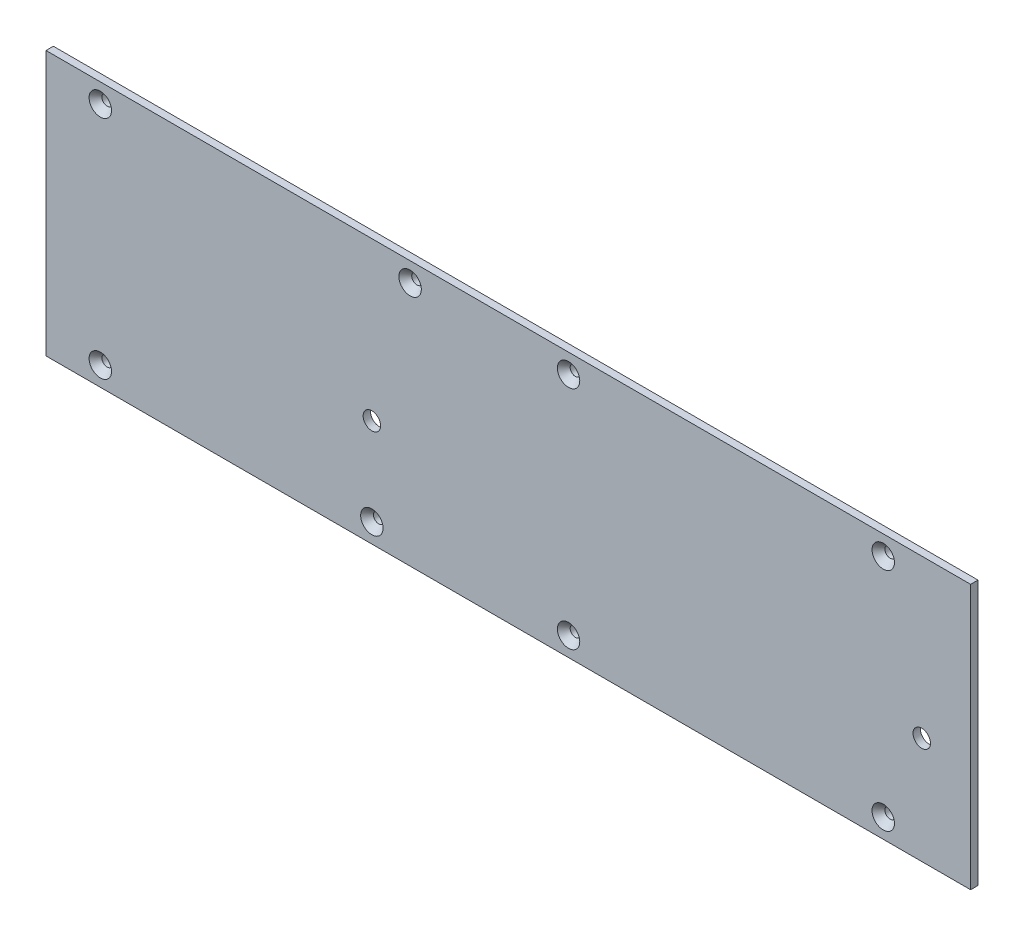
ISO-10303-21;
HEADER;
FILE_DESCRIPTION(('STEP AP214'),'2;1');
FILE_NAME('part.step','',(''),(''),'','','');
FILE_SCHEMA(('AUTOMOTIVE_DESIGN { 1 0 10303 214 1 1 1 1 }'));
ENDSEC;
DATA;
#1=APPLICATION_CONTEXT('core data for automotive mechanical design processes');
#2=APPLICATION_PROTOCOL_DEFINITION('international standard','automotive_design',2000,#1);
#3=PRODUCT_CONTEXT('',#1,'mechanical');
#4=PRODUCT('Part','Part','',(#3));
#5=PRODUCT_RELATED_PRODUCT_CATEGORY('part','',(#4));
#6=PRODUCT_DEFINITION_FORMATION('','',#4);
#7=PRODUCT_DEFINITION_CONTEXT('part definition',#1,'design');
#8=PRODUCT_DEFINITION('design','',#6,#7);
#9=PRODUCT_DEFINITION_SHAPE('','',#8);
#10=(LENGTH_UNIT() NAMED_UNIT(*) SI_UNIT(.MILLI.,.METRE.));
#11=(NAMED_UNIT(*) PLANE_ANGLE_UNIT() SI_UNIT($,.RADIAN.));
#12=(NAMED_UNIT(*) SI_UNIT($,.STERADIAN.) SOLID_ANGLE_UNIT());
#13=UNCERTAINTY_MEASURE_WITH_UNIT(LENGTH_MEASURE(1.E-05),#10,'distance_accuracy_value','');
#14=(GEOMETRIC_REPRESENTATION_CONTEXT(3) GLOBAL_UNCERTAINTY_ASSIGNED_CONTEXT((#13)) GLOBAL_UNIT_ASSIGNED_CONTEXT((#10,
#11,#12)) REPRESENTATION_CONTEXT('',''));
#15=CARTESIAN_POINT('',(0.,0.,0.));
#16=DIRECTION('',(0.,0.,1.));
#17=DIRECTION('',(1.,0.,0.));
#18=AXIS2_PLACEMENT_3D('',#15,#16,#17);
#19=CARTESIAN_POINT('',(-40.9702,-33.9217,1.1049));
#20=DIRECTION('',(0.,0.,1.));
#21=DIRECTION('',(1.,0.,0.));
#22=AXIS2_PLACEMENT_3D('',#19,#20,#21);
#23=CONICAL_SURFACE('',#22,3.3655,0.71558499331767);
#24=CARTESIAN_POINT('',(-40.9702,-33.9217,1.1049));
#25=DIRECTION('',(0.,0.,1.));
#26=DIRECTION('',(1.,0.,0.));
#27=AXIS2_PLACEMENT_3D('',#24,#25,#26);
#28=CIRCLE('',#27,3.3655);
#29=CARTESIAN_POINT('',(-37.6047,-33.9217,1.1049));
#30=VERTEX_POINT('',#29);
#31=EDGE_CURVE('E20',#30,#30,#28,.F.);
#32=ORIENTED_EDGE('',*,*,#31,.F.);
#33=EDGE_LOOP('',(#32));
#34=FACE_BOUND('',#33,.T.);
#35=CARTESIAN_POINT('',(-40.9702,-33.9217,-0.955064706810657));
#36=DIRECTION('',(0.,0.,-1.));
#37=DIRECTION('',(-1.,0.,0.));
#38=AXIS2_PLACEMENT_3D('',#35,#36,#37);
#39=CIRCLE('',#38,1.57480000000001);
#40=CARTESIAN_POINT('',(-42.545,-33.9217,-0.955064706810657));
#41=VERTEX_POINT('',#40);
#42=EDGE_CURVE('E106',#41,#41,#39,.T.);
#43=ORIENTED_EDGE('',*,*,#42,.T.);
#44=EDGE_LOOP('',(#43));
#45=FACE_BOUND('',#44,.T.);
#46=ADVANCED_FACE('F16',(#34,#45),#23,.F.);
#47=CARTESIAN_POINT('',(112.5728,-33.9217,1.1049));
#48=DIRECTION('',(0.,0.,1.));
#49=DIRECTION('',(1.,0.,0.));
#50=AXIS2_PLACEMENT_3D('',#47,#48,#49);
#51=CONICAL_SURFACE('',#50,3.36550000000001,0.715584993317676);
#52=CARTESIAN_POINT('',(112.5728,-33.9217,1.1049));
#53=DIRECTION('',(0.,0.,1.));
#54=DIRECTION('',(1.,0.,0.));
#55=AXIS2_PLACEMENT_3D('',#52,#53,#54);
#56=CIRCLE('',#55,3.36550000000001);
#57=CARTESIAN_POINT('',(115.9383,-33.9217,1.1049));
#58=VERTEX_POINT('',#57);
#59=EDGE_CURVE('E207',#58,#58,#56,.F.);
#60=ORIENTED_EDGE('',*,*,#59,.F.);
#61=EDGE_LOOP('',(#60));
#62=FACE_BOUND('',#61,.T.);
#63=CARTESIAN_POINT('',(112.5728,-33.9217,-0.955064706810657));
#64=DIRECTION('',(0.,0.,-1.));
#65=DIRECTION('',(-1.,0.,0.));
#66=AXIS2_PLACEMENT_3D('',#63,#64,#65);
#67=CIRCLE('',#66,1.57479999999999);
#68=CARTESIAN_POINT('',(110.998,-33.9217,-0.955064706810657));
#69=VERTEX_POINT('',#68);
#70=EDGE_CURVE('E88',#69,#69,#67,.T.);
#71=ORIENTED_EDGE('',*,*,#70,.T.);
#72=EDGE_LOOP('',(#71));
#73=FACE_BOUND('',#72,.T.);
#74=ADVANCED_FACE('F218',(#62,#73),#51,.F.);
#75=CARTESIAN_POINT('',(18.0848,33.9217,1.1049));
#76=DIRECTION('',(0.,0.,1.));
#77=DIRECTION('',(1.,0.,0.));
#78=AXIS2_PLACEMENT_3D('',#75,#76,#77);
#79=CONICAL_SURFACE('',#78,3.3655,0.71558499331767);
#80=CARTESIAN_POINT('',(18.0848,33.9217,1.1049));
#81=DIRECTION('',(0.,0.,1.));
#82=DIRECTION('',(1.,0.,0.));
#83=AXIS2_PLACEMENT_3D('',#80,#81,#82);
#84=CIRCLE('',#83,3.3655);
#85=CARTESIAN_POINT('',(21.4503,33.9217,1.1049));
#86=VERTEX_POINT('',#85);
#87=EDGE_CURVE('E205',#86,#86,#84,.F.);
#88=ORIENTED_EDGE('',*,*,#87,.F.);
#89=EDGE_LOOP('',(#88));
#90=FACE_BOUND('',#89,.T.);
#91=CARTESIAN_POINT('',(18.0848,33.9217,-0.955064706810657));
#92=DIRECTION('',(0.,0.,-1.));
#93=DIRECTION('',(-1.,0.,0.));
#94=AXIS2_PLACEMENT_3D('',#91,#92,#93);
#95=CIRCLE('',#94,1.5748);
#96=CARTESIAN_POINT('',(16.51,33.9217,-0.955064706810657));
#97=VERTEX_POINT('',#96);
#98=EDGE_CURVE('E100',#97,#97,#95,.T.);
#99=ORIENTED_EDGE('',*,*,#98,.T.);
#100=EDGE_LOOP('',(#99));
#101=FACE_BOUND('',#100,.T.);
#102=ADVANCED_FACE('F312',(#90,#101),#79,.F.);
#103=CARTESIAN_POINT('',(-122.5042,33.9217,1.1049));
#104=DIRECTION('',(0.,0.,1.));
#105=DIRECTION('',(1.,0.,0.));
#106=AXIS2_PLACEMENT_3D('',#103,#104,#105);
#107=CONICAL_SURFACE('',#106,3.36550000000001,0.715584993317676);
#108=CARTESIAN_POINT('',(-122.5042,33.9217,1.1049));
#109=DIRECTION('',(0.,0.,1.));
#110=DIRECTION('',(1.,0.,0.));
#111=AXIS2_PLACEMENT_3D('',#108,#109,#110);
#112=CIRCLE('',#111,3.36550000000001);
#113=CARTESIAN_POINT('',(-119.1387,33.9217,1.1049));
#114=VERTEX_POINT('',#113);
#115=EDGE_CURVE('E202',#114,#114,#112,.F.);
#116=ORIENTED_EDGE('',*,*,#115,.F.);
#117=EDGE_LOOP('',(#116));
#118=FACE_BOUND('',#117,.T.);
#119=CARTESIAN_POINT('',(-122.5042,33.9217,-0.955064706810657));
#120=DIRECTION('',(0.,0.,-1.));
#121=DIRECTION('',(-1.,0.,0.));
#122=AXIS2_PLACEMENT_3D('',#119,#120,#121);
#123=CIRCLE('',#122,1.5748);
#124=CARTESIAN_POINT('',(-124.079,33.9217,-0.955064706810657));
#125=VERTEX_POINT('',#124);
#126=EDGE_CURVE('E97',#125,#125,#123,.T.);
#127=ORIENTED_EDGE('',*,*,#126,.T.);
#128=EDGE_LOOP('',(#127));
#129=FACE_BOUND('',#128,.T.);
#130=ADVANCED_FACE('F316',(#118,#129),#107,.F.);
#131=CARTESIAN_POINT('',(-29.4894,33.9217,1.1049));
#132=DIRECTION('',(0.,0.,1.));
#133=DIRECTION('',(1.,0.,0.));
#134=AXIS2_PLACEMENT_3D('',#131,#132,#133);
#135=CONICAL_SURFACE('',#134,3.3655,0.715584993317678);
#136=CARTESIAN_POINT('',(-29.4894,33.9217,1.1049));
#137=DIRECTION('',(0.,0.,1.));
#138=DIRECTION('',(1.,0.,0.));
#139=AXIS2_PLACEMENT_3D('',#136,#137,#138);
#140=CIRCLE('',#139,3.3655);
#141=CARTESIAN_POINT('',(-26.1239,33.9217,1.1049));
#142=VERTEX_POINT('',#141);
#143=EDGE_CURVE('E199',#142,#142,#140,.F.);
#144=ORIENTED_EDGE('',*,*,#143,.F.);
#145=EDGE_LOOP('',(#144));
#146=FACE_BOUND('',#145,.T.);
#147=CARTESIAN_POINT('',(-29.4894,33.9217,-0.955064706810657));
#148=DIRECTION('',(0.,0.,-1.));
#149=DIRECTION('',(-1.,0.,0.));
#150=AXIS2_PLACEMENT_3D('',#147,#148,#149);
#151=CIRCLE('',#150,1.57479999999999);
#152=CARTESIAN_POINT('',(-31.0642,33.9217,-0.955064706810657));
#153=VERTEX_POINT('',#152);
#154=EDGE_CURVE('E94',#153,#153,#151,.T.);
#155=ORIENTED_EDGE('',*,*,#154,.T.);
#156=EDGE_LOOP('',(#155));
#157=FACE_BOUND('',#156,.T.);
#158=ADVANCED_FACE('F320',(#146,#157),#135,.F.);
#159=CARTESIAN_POINT('',(112.5728,33.9217,1.1049));
#160=DIRECTION('',(0.,0.,1.));
#161=DIRECTION('',(1.,0.,0.));
#162=AXIS2_PLACEMENT_3D('',#159,#160,#161);
#163=CONICAL_SURFACE('',#162,3.36550000000001,0.715584993317676);
#164=CARTESIAN_POINT('',(112.5728,33.9217,1.1049));
#165=DIRECTION('',(0.,0.,1.));
#166=DIRECTION('',(1.,0.,0.));
#167=AXIS2_PLACEMENT_3D('',#164,#165,#166);
#168=CIRCLE('',#167,3.36550000000001);
#169=CARTESIAN_POINT('',(115.9383,33.9217,1.1049));
#170=VERTEX_POINT('',#169);
#171=EDGE_CURVE('E196',#170,#170,#168,.F.);
#172=ORIENTED_EDGE('',*,*,#171,.F.);
#173=EDGE_LOOP('',(#172));
#174=FACE_BOUND('',#173,.T.);
#175=CARTESIAN_POINT('',(112.5728,33.9217,-0.955064706810657));
#176=DIRECTION('',(0.,0.,-1.));
#177=DIRECTION('',(-1.,0.,0.));
#178=AXIS2_PLACEMENT_3D('',#175,#176,#177);
#179=CIRCLE('',#178,1.57479999999998);
#180=CARTESIAN_POINT('',(110.998,33.9217,-0.955064706810657));
#181=VERTEX_POINT('',#180);
#182=EDGE_CURVE('E91',#181,#181,#179,.T.);
#183=ORIENTED_EDGE('',*,*,#182,.T.);
#184=EDGE_LOOP('',(#183));
#185=FACE_BOUND('',#184,.T.);
#186=ADVANCED_FACE('F324',(#174,#185),#163,.F.);
#187=CARTESIAN_POINT('',(18.0848,-33.9217,1.1049));
#188=DIRECTION('',(0.,0.,1.));
#189=DIRECTION('',(1.,0.,0.));
#190=AXIS2_PLACEMENT_3D('',#187,#188,#189);
#191=CONICAL_SURFACE('',#190,3.3655,0.71558499331767);
#192=CARTESIAN_POINT('',(18.0848,-33.9217,1.1049));
#193=DIRECTION('',(0.,0.,1.));
#194=DIRECTION('',(1.,0.,0.));
#195=AXIS2_PLACEMENT_3D('',#192,#193,#194);
#196=CIRCLE('',#195,3.3655);
#197=CARTESIAN_POINT('',(21.4503,-33.9217,1.1049));
#198=VERTEX_POINT('',#197);
#199=EDGE_CURVE('E193',#198,#198,#196,.F.);
#200=ORIENTED_EDGE('',*,*,#199,.F.);
#201=EDGE_LOOP('',(#200));
#202=FACE_BOUND('',#201,.T.);
#203=CARTESIAN_POINT('',(18.0848,-33.9217,-0.955064706810657));
#204=DIRECTION('',(0.,0.,-1.));
#205=DIRECTION('',(-1.,0.,0.));
#206=AXIS2_PLACEMENT_3D('',#203,#204,#205);
#207=CIRCLE('',#206,1.5748);
#208=CARTESIAN_POINT('',(16.51,-33.9217,-0.955064706810657));
#209=VERTEX_POINT('',#208);
#210=EDGE_CURVE('E85',#209,#209,#207,.T.);
#211=ORIENTED_EDGE('',*,*,#210,.T.);
#212=EDGE_LOOP('',(#211));
#213=FACE_BOUND('',#212,.T.);
#214=ADVANCED_FACE('F328',(#202,#213),#191,.F.);
#215=CARTESIAN_POINT('',(-122.5042,-33.9217,1.1049));
#216=DIRECTION('',(0.,0.,1.));
#217=DIRECTION('',(1.,0.,0.));
#218=AXIS2_PLACEMENT_3D('',#215,#216,#217);
#219=CONICAL_SURFACE('',#218,3.36550000000001,0.715584993317679);
#220=CARTESIAN_POINT('',(-122.5042,-33.9217,1.1049));
#221=DIRECTION('',(0.,0.,1.));
#222=DIRECTION('',(1.,0.,0.));
#223=AXIS2_PLACEMENT_3D('',#220,#221,#222);
#224=CIRCLE('',#223,3.36550000000001);
#225=CARTESIAN_POINT('',(-119.1387,-33.9217,1.1049));
#226=VERTEX_POINT('',#225);
#227=EDGE_CURVE('E190',#226,#226,#224,.F.);
#228=ORIENTED_EDGE('',*,*,#227,.F.);
#229=EDGE_LOOP('',(#228));
#230=FACE_BOUND('',#229,.T.);
#231=CARTESIAN_POINT('',(-122.5042,-33.9217,-0.955064706810657));
#232=DIRECTION('',(0.,0.,-1.));
#233=DIRECTION('',(-1.,0.,0.));
#234=AXIS2_PLACEMENT_3D('',#231,#232,#233);
#235=CIRCLE('',#234,1.57480000000001);
#236=CARTESIAN_POINT('',(-124.079,-33.9217,-0.955064706810657));
#237=VERTEX_POINT('',#236);
#238=EDGE_CURVE('E103',#237,#237,#235,.T.);
#239=ORIENTED_EDGE('',*,*,#238,.T.);
#240=EDGE_LOOP('',(#239));
#241=FACE_BOUND('',#240,.T.);
#242=ADVANCED_FACE('F226',(#230,#241),#219,.F.);
#243=CARTESIAN_POINT('',(-40.9702,-33.9217,-0.955064706810657));
#244=DIRECTION('',(0.,0.,-1.));
#245=DIRECTION('',(-1.,0.,0.));
#246=AXIS2_PLACEMENT_3D('',#243,#244,#245);
#247=CYLINDRICAL_SURFACE('',#246,1.57480000000001);
#248=ORIENTED_EDGE('',*,*,#42,.F.);
#249=EDGE_LOOP('',(#248));
#250=FACE_BOUND('',#249,.T.);
#251=CARTESIAN_POINT('',(-40.9702,-33.9217,-3.4925));
#252=DIRECTION('',(0.,0.,-1.));
#253=DIRECTION('',(-1.,0.,0.));
#254=AXIS2_PLACEMENT_3D('',#251,#252,#253);
#255=CIRCLE('',#254,1.57480000000001);
#256=CARTESIAN_POINT('',(-42.545,-33.9217,-3.4925));
#257=VERTEX_POINT('',#256);
#258=EDGE_CURVE('E187',#257,#257,#255,.F.);
#259=ORIENTED_EDGE('',*,*,#258,.F.);
#260=EDGE_LOOP('',(#259));
#261=FACE_BOUND('',#260,.T.);
#262=ADVANCED_FACE('F222',(#250,#261),#247,.F.);
#263=CARTESIAN_POINT('',(-122.5042,-33.9217,-0.955064706810657));
#264=DIRECTION('',(0.,0.,-1.));
#265=DIRECTION('',(-1.,0.,0.));
#266=AXIS2_PLACEMENT_3D('',#263,#264,#265);
#267=CYLINDRICAL_SURFACE('',#266,1.57480000000001);
#268=ORIENTED_EDGE('',*,*,#238,.F.);
#269=EDGE_LOOP('',(#268));
#270=FACE_BOUND('',#269,.T.);
#271=CARTESIAN_POINT('',(-122.5042,-33.9217,-3.4925));
#272=DIRECTION('',(0.,0.,-1.));
#273=DIRECTION('',(-1.,0.,0.));
#274=AXIS2_PLACEMENT_3D('',#271,#272,#273);
#275=CIRCLE('',#274,1.57480000000001);
#276=CARTESIAN_POINT('',(-124.079,-33.9217,-3.4925));
#277=VERTEX_POINT('',#276);
#278=EDGE_CURVE('E184',#277,#277,#275,.F.);
#279=ORIENTED_EDGE('',*,*,#278,.F.);
#280=EDGE_LOOP('',(#279));
#281=FACE_BOUND('',#280,.T.);
#282=ADVANCED_FACE('F225',(#270,#281),#267,.F.);
#283=CARTESIAN_POINT('',(18.0848,33.9217,-0.955064706810657));
#284=DIRECTION('',(0.,0.,-1.));
#285=DIRECTION('',(-1.,0.,0.));
#286=AXIS2_PLACEMENT_3D('',#283,#284,#285);
#287=CYLINDRICAL_SURFACE('',#286,1.5748);
#288=ORIENTED_EDGE('',*,*,#98,.F.);
#289=EDGE_LOOP('',(#288));
#290=FACE_BOUND('',#289,.T.);
#291=CARTESIAN_POINT('',(18.0848,33.9217,-3.4925));
#292=DIRECTION('',(0.,0.,-1.));
#293=DIRECTION('',(-1.,0.,0.));
#294=AXIS2_PLACEMENT_3D('',#291,#292,#293);
#295=CIRCLE('',#294,1.5748);
#296=CARTESIAN_POINT('',(16.51,33.9217,-3.4925));
#297=VERTEX_POINT('',#296);
#298=EDGE_CURVE('E181',#297,#297,#295,.F.);
#299=ORIENTED_EDGE('',*,*,#298,.F.);
#300=EDGE_LOOP('',(#299));
#301=FACE_BOUND('',#300,.T.);
#302=ADVANCED_FACE('F338',(#290,#301),#287,.F.);
#303=CARTESIAN_POINT('',(-122.5042,33.9217,-0.955064706810657));
#304=DIRECTION('',(0.,0.,-1.));
#305=DIRECTION('',(-1.,0.,0.));
#306=AXIS2_PLACEMENT_3D('',#303,#304,#305);
#307=CYLINDRICAL_SURFACE('',#306,1.5748);
#308=ORIENTED_EDGE('',*,*,#126,.F.);
#309=EDGE_LOOP('',(#308));
#310=FACE_BOUND('',#309,.T.);
#311=CARTESIAN_POINT('',(-122.5042,33.9217,-3.4925));
#312=DIRECTION('',(0.,0.,-1.));
#313=DIRECTION('',(-1.,0.,0.));
#314=AXIS2_PLACEMENT_3D('',#311,#312,#313);
#315=CIRCLE('',#314,1.5748);
#316=CARTESIAN_POINT('',(-124.079,33.9217,-3.4925));
#317=VERTEX_POINT('',#316);
#318=EDGE_CURVE('E178',#317,#317,#315,.F.);
#319=ORIENTED_EDGE('',*,*,#318,.F.);
#320=EDGE_LOOP('',(#319));
#321=FACE_BOUND('',#320,.T.);
#322=ADVANCED_FACE('F342',(#310,#321),#307,.F.);
#323=CARTESIAN_POINT('',(-29.4894,33.9217,-0.955064706810657));
#324=DIRECTION('',(0.,0.,-1.));
#325=DIRECTION('',(-1.,0.,0.));
#326=AXIS2_PLACEMENT_3D('',#323,#324,#325);
#327=CYLINDRICAL_SURFACE('',#326,1.57479999999999);
#328=ORIENTED_EDGE('',*,*,#154,.F.);
#329=EDGE_LOOP('',(#328));
#330=FACE_BOUND('',#329,.T.);
#331=CARTESIAN_POINT('',(-29.4894,33.9217,-3.4925));
#332=DIRECTION('',(0.,0.,-1.));
#333=DIRECTION('',(-1.,0.,0.));
#334=AXIS2_PLACEMENT_3D('',#331,#332,#333);
#335=CIRCLE('',#334,1.57479999999999);
#336=CARTESIAN_POINT('',(-31.0642,33.9217,-3.4925));
#337=VERTEX_POINT('',#336);
#338=EDGE_CURVE('E175',#337,#337,#335,.F.);
#339=ORIENTED_EDGE('',*,*,#338,.F.);
#340=EDGE_LOOP('',(#339));
#341=FACE_BOUND('',#340,.T.);
#342=ADVANCED_FACE('F346',(#330,#341),#327,.F.);
#343=CARTESIAN_POINT('',(112.5728,33.9217,-0.955064706810657));
#344=DIRECTION('',(0.,0.,-1.));
#345=DIRECTION('',(-1.,0.,0.));
#346=AXIS2_PLACEMENT_3D('',#343,#344,#345);
#347=CYLINDRICAL_SURFACE('',#346,1.57479999999998);
#348=ORIENTED_EDGE('',*,*,#182,.F.);
#349=EDGE_LOOP('',(#348));
#350=FACE_BOUND('',#349,.T.);
#351=CARTESIAN_POINT('',(112.5728,33.9217,-3.4925));
#352=DIRECTION('',(0.,0.,-1.));
#353=DIRECTION('',(-1.,0.,0.));
#354=AXIS2_PLACEMENT_3D('',#351,#352,#353);
#355=CIRCLE('',#354,1.57479999999998);
#356=CARTESIAN_POINT('',(110.998,33.9217,-3.4925));
#357=VERTEX_POINT('',#356);
#358=EDGE_CURVE('E172',#357,#357,#355,.F.);
#359=ORIENTED_EDGE('',*,*,#358,.F.);
#360=EDGE_LOOP('',(#359));
#361=FACE_BOUND('',#360,.T.);
#362=ADVANCED_FACE('F350',(#350,#361),#347,.F.);
#363=CARTESIAN_POINT('',(112.5728,-33.9217,-0.955064706810657));
#364=DIRECTION('',(0.,0.,-1.));
#365=DIRECTION('',(-1.,0.,0.));
#366=AXIS2_PLACEMENT_3D('',#363,#364,#365);
#367=CYLINDRICAL_SURFACE('',#366,1.57479999999999);
#368=ORIENTED_EDGE('',*,*,#70,.F.);
#369=EDGE_LOOP('',(#368));
#370=FACE_BOUND('',#369,.T.);
#371=CARTESIAN_POINT('',(112.5728,-33.9217,-3.4925));
#372=DIRECTION('',(0.,0.,-1.));
#373=DIRECTION('',(-1.,0.,0.));
#374=AXIS2_PLACEMENT_3D('',#371,#372,#373);
#375=CIRCLE('',#374,1.57479999999999);
#376=CARTESIAN_POINT('',(110.998,-33.9217,-3.4925));
#377=VERTEX_POINT('',#376);
#378=EDGE_CURVE('E169',#377,#377,#375,.F.);
#379=ORIENTED_EDGE('',*,*,#378,.F.);
#380=EDGE_LOOP('',(#379));
#381=FACE_BOUND('',#380,.T.);
#382=ADVANCED_FACE('F354',(#370,#381),#367,.F.);
#383=CARTESIAN_POINT('',(18.0848,-33.9217,-0.955064706810657));
#384=DIRECTION('',(0.,0.,-1.));
#385=DIRECTION('',(-1.,0.,0.));
#386=AXIS2_PLACEMENT_3D('',#383,#384,#385);
#387=CYLINDRICAL_SURFACE('',#386,1.5748);
#388=ORIENTED_EDGE('',*,*,#210,.F.);
#389=EDGE_LOOP('',(#388));
#390=FACE_BOUND('',#389,.T.);
#391=CARTESIAN_POINT('',(18.0848,-33.9217,-3.4925));
#392=DIRECTION('',(0.,0.,-1.));
#393=DIRECTION('',(-1.,0.,0.));
#394=AXIS2_PLACEMENT_3D('',#391,#392,#393);
#395=CIRCLE('',#394,1.5748);
#396=CARTESIAN_POINT('',(16.51,-33.9217,-3.4925));
#397=VERTEX_POINT('',#396);
#398=EDGE_CURVE('E76',#397,#397,#395,.F.);
#399=ORIENTED_EDGE('',*,*,#398,.F.);
#400=EDGE_LOOP('',(#399));
#401=FACE_BOUND('',#400,.T.);
#402=ADVANCED_FACE('F307',(#390,#401),#387,.F.);
#403=CARTESIAN_POINT('',(0.,0.,1.1049));
#404=DIRECTION('',(0.,0.,1.));
#405=DIRECTION('',(1.,0.,0.));
#406=AXIS2_PLACEMENT_3D('',#403,#404,#405);
#407=PLANE('',#406);
#408=ORIENTED_EDGE('',*,*,#227,.T.);
#409=EDGE_LOOP('',(#408));
#410=FACE_BOUND('',#409,.T.);
#411=ORIENTED_EDGE('',*,*,#199,.T.);
#412=EDGE_LOOP('',(#411));
#413=FACE_BOUND('',#412,.T.);
#414=ORIENTED_EDGE('',*,*,#171,.T.);
#415=EDGE_LOOP('',(#414));
#416=FACE_BOUND('',#415,.T.);
#417=ORIENTED_EDGE('',*,*,#143,.T.);
#418=EDGE_LOOP('',(#417));
#419=FACE_BOUND('',#418,.T.);
#420=ORIENTED_EDGE('',*,*,#115,.T.);
#421=EDGE_LOOP('',(#420));
#422=FACE_BOUND('',#421,.T.);
#423=ORIENTED_EDGE('',*,*,#87,.T.);
#424=EDGE_LOOP('',(#423));
#425=FACE_BOUND('',#424,.T.);
#426=ORIENTED_EDGE('',*,*,#59,.T.);
#427=EDGE_LOOP('',(#426));
#428=FACE_BOUND('',#427,.T.);
#429=ORIENTED_EDGE('',*,*,#31,.T.);
#430=EDGE_LOOP('',(#429));
#431=FACE_BOUND('',#430,.T.);
#432=CARTESIAN_POINT('',(124.1298,-7.65810000000001,1.1049));
#433=DIRECTION('',(0.,0.,-1.));
#434=DIRECTION('',(-1.,0.,0.));
#435=AXIS2_PLACEMENT_3D('',#432,#433,#434);
#436=CIRCLE('',#435,2.61619999999998);
#437=CARTESIAN_POINT('',(121.5136,-7.65810000000001,1.1049));
#438=VERTEX_POINT('',#437);
#439=EDGE_CURVE('E160',#438,#438,#436,.T.);
#440=ORIENTED_EDGE('',*,*,#439,.T.);
#441=EDGE_LOOP('',(#440));
#442=FACE_BOUND('',#441,.T.);
#443=CARTESIAN_POINT('',(-40.9702,-7.6581,1.1049));
#444=DIRECTION('',(0.,0.,-1.));
#445=DIRECTION('',(-1.,0.,0.));
#446=AXIS2_PLACEMENT_3D('',#443,#444,#445);
#447=CIRCLE('',#446,2.6162);
#448=CARTESIAN_POINT('',(-43.5864,-7.6581,1.1049));
#449=VERTEX_POINT('',#448);
#450=EDGE_CURVE('E163',#449,#449,#447,.T.);
#451=ORIENTED_EDGE('',*,*,#450,.T.);
#452=EDGE_LOOP('',(#451));
#453=FACE_BOUND('',#452,.T.);
#454=DIRECTION('',(0.,1.,0.));
#455=VECTOR('',#454,1.);
#456=CARTESIAN_POINT('',(-138.811,-39.7129,1.1049));
#457=LINE('',#456,#455);
#458=CARTESIAN_POINT('',(-138.811,-39.7129,1.1049));
#459=VERTEX_POINT('',#458);
#460=CARTESIAN_POINT('',(-138.811,39.7129,1.1049));
#461=VERTEX_POINT('',#460);
#462=EDGE_CURVE('E72',#459,#461,#457,.T.);
#463=ORIENTED_EDGE('',*,*,#462,.F.);
#464=DIRECTION('',(1.,0.,0.));
#465=VECTOR('',#464,1.);
#466=CARTESIAN_POINT('',(138.811,-39.7129,1.1049));
#467=LINE('',#466,#465);
#468=CARTESIAN_POINT('',(138.811,-39.7129,1.1049));
#469=VERTEX_POINT('',#468);
#470=EDGE_CURVE('E68',#469,#459,#467,.F.);
#471=ORIENTED_EDGE('',*,*,#470,.F.);
#472=DIRECTION('',(0.,1.,0.));
#473=VECTOR('',#472,1.);
#474=CARTESIAN_POINT('',(138.811,39.7129,1.1049));
#475=LINE('',#474,#473);
#476=CARTESIAN_POINT('',(138.811,39.7129,1.1049));
#477=VERTEX_POINT('',#476);
#478=EDGE_CURVE('E59',#477,#469,#475,.F.);
#479=ORIENTED_EDGE('',*,*,#478,.F.);
#480=DIRECTION('',(1.,0.,0.));
#481=VECTOR('',#480,1.);
#482=CARTESIAN_POINT('',(-138.811,39.7129,1.1049));
#483=LINE('',#482,#481);
#484=EDGE_CURVE('E54',#461,#477,#483,.T.);
#485=ORIENTED_EDGE('',*,*,#484,.F.);
#486=EDGE_LOOP('',(#463,#471,#479,#485));
#487=FACE_BOUND('',#486,.T.);
#488=ADVANCED_FACE('F71',(#410,#413,#416,#419,#422,#425,#428,#431,#442,#453,#487),#407,.T.);
#489=CARTESIAN_POINT('',(-40.9702,-33.9217,-3.4925));
#490=DIRECTION('',(0.,0.,-1.));
#491=DIRECTION('',(-1.,0.,0.));
#492=AXIS2_PLACEMENT_3D('',#489,#490,#491);
#493=PLANE('',#492);
#494=ORIENTED_EDGE('',*,*,#258,.T.);
#495=EDGE_LOOP('',(#494));
#496=FACE_BOUND('',#495,.T.);
#497=CARTESIAN_POINT('',(-40.9702,-33.9217,-3.4925));
#498=DIRECTION('',(0.,0.,-1.));
#499=DIRECTION('',(-1.,0.,0.));
#500=AXIS2_PLACEMENT_3D('',#497,#498,#499);
#501=CIRCLE('',#500,3.3401);
#502=CARTESIAN_POINT('',(-44.3103,-33.9217,-3.4925));
#503=VERTEX_POINT('',#502);
#504=EDGE_CURVE('E157',#503,#503,#501,.F.);
#505=ORIENTED_EDGE('',*,*,#504,.F.);
#506=EDGE_LOOP('',(#505));
#507=FACE_BOUND('',#506,.T.);
#508=ADVANCED_FACE('F230',(#496,#507),#493,.T.);
#509=CARTESIAN_POINT('',(-122.5042,-33.9217,-3.4925));
#510=DIRECTION('',(0.,0.,-1.));
#511=DIRECTION('',(-1.,0.,0.));
#512=AXIS2_PLACEMENT_3D('',#509,#510,#511);
#513=PLANE('',#512);
#514=ORIENTED_EDGE('',*,*,#278,.T.);
#515=EDGE_LOOP('',(#514));
#516=FACE_BOUND('',#515,.T.);
#517=CARTESIAN_POINT('',(-122.5042,-33.9217,-3.4925));
#518=DIRECTION('',(0.,0.,-1.));
#519=DIRECTION('',(-1.,0.,0.));
#520=AXIS2_PLACEMENT_3D('',#517,#518,#519);
#521=CIRCLE('',#520,3.3401);
#522=CARTESIAN_POINT('',(-125.8443,-33.9217,-3.4925));
#523=VERTEX_POINT('',#522);
#524=EDGE_CURVE('E154',#523,#523,#521,.F.);
#525=ORIENTED_EDGE('',*,*,#524,.F.);
#526=EDGE_LOOP('',(#525));
#527=FACE_BOUND('',#526,.T.);
#528=ADVANCED_FACE('F233',(#516,#527),#513,.T.);
#529=CARTESIAN_POINT('',(18.0848,33.9217,-3.4925));
#530=DIRECTION('',(0.,0.,-1.));
#531=DIRECTION('',(-1.,0.,0.));
#532=AXIS2_PLACEMENT_3D('',#529,#530,#531);
#533=PLANE('',#532);
#534=ORIENTED_EDGE('',*,*,#298,.T.);
#535=EDGE_LOOP('',(#534));
#536=FACE_BOUND('',#535,.T.);
#537=CARTESIAN_POINT('',(18.0848,33.9217,-3.4925));
#538=DIRECTION('',(0.,0.,-1.));
#539=DIRECTION('',(-1.,0.,0.));
#540=AXIS2_PLACEMENT_3D('',#537,#538,#539);
#541=CIRCLE('',#540,3.3401);
#542=CARTESIAN_POINT('',(14.7447,33.9217,-3.4925));
#543=VERTEX_POINT('',#542);
#544=EDGE_CURVE('E151',#543,#543,#541,.F.);
#545=ORIENTED_EDGE('',*,*,#544,.F.);
#546=EDGE_LOOP('',(#545));
#547=FACE_BOUND('',#546,.T.);
#548=ADVANCED_FACE('F290',(#536,#547),#533,.T.);
#549=CARTESIAN_POINT('',(-122.5042,33.9217,-3.4925));
#550=DIRECTION('',(0.,0.,-1.));
#551=DIRECTION('',(-1.,0.,0.));
#552=AXIS2_PLACEMENT_3D('',#549,#550,#551);
#553=PLANE('',#552);
#554=ORIENTED_EDGE('',*,*,#318,.T.);
#555=EDGE_LOOP('',(#554));
#556=FACE_BOUND('',#555,.T.);
#557=CARTESIAN_POINT('',(-122.5042,33.9217,-3.4925));
#558=DIRECTION('',(0.,0.,-1.));
#559=DIRECTION('',(-1.,0.,0.));
#560=AXIS2_PLACEMENT_3D('',#557,#558,#559);
#561=CIRCLE('',#560,3.3401);
#562=CARTESIAN_POINT('',(-125.8443,33.9217,-3.4925));
#563=VERTEX_POINT('',#562);
#564=EDGE_CURVE('E148',#563,#563,#561,.F.);
#565=ORIENTED_EDGE('',*,*,#564,.F.);
#566=EDGE_LOOP('',(#565));
#567=FACE_BOUND('',#566,.T.);
#568=ADVANCED_FACE('F292',(#556,#567),#553,.T.);
#569=CARTESIAN_POINT('',(-29.4894,33.9217,-3.4925));
#570=DIRECTION('',(0.,0.,-1.));
#571=DIRECTION('',(-1.,0.,0.));
#572=AXIS2_PLACEMENT_3D('',#569,#570,#571);
#573=PLANE('',#572);
#574=ORIENTED_EDGE('',*,*,#338,.T.);
#575=EDGE_LOOP('',(#574));
#576=FACE_BOUND('',#575,.T.);
#577=CARTESIAN_POINT('',(-29.4894,33.9217,-3.4925));
#578=DIRECTION('',(0.,0.,-1.));
#579=DIRECTION('',(-1.,0.,0.));
#580=AXIS2_PLACEMENT_3D('',#577,#578,#579);
#581=CIRCLE('',#580,3.3401);
#582=CARTESIAN_POINT('',(-32.8295,33.9217,-3.4925));
#583=VERTEX_POINT('',#582);
#584=EDGE_CURVE('E145',#583,#583,#581,.F.);
#585=ORIENTED_EDGE('',*,*,#584,.F.);
#586=EDGE_LOOP('',(#585));
#587=FACE_BOUND('',#586,.T.);
#588=ADVANCED_FACE('F299',(#576,#587),#573,.T.);
#589=CARTESIAN_POINT('',(112.5728,33.9217,-3.4925));
#590=DIRECTION('',(0.,0.,-1.));
#591=DIRECTION('',(-1.,0.,0.));
#592=AXIS2_PLACEMENT_3D('',#589,#590,#591);
#593=PLANE('',#592);
#594=ORIENTED_EDGE('',*,*,#358,.T.);
#595=EDGE_LOOP('',(#594));
#596=FACE_BOUND('',#595,.T.);
#597=CARTESIAN_POINT('',(112.5728,33.9217,-3.4925));
#598=DIRECTION('',(0.,0.,-1.));
#599=DIRECTION('',(-1.,0.,0.));
#600=AXIS2_PLACEMENT_3D('',#597,#598,#599);
#601=CIRCLE('',#600,3.3401);
#602=CARTESIAN_POINT('',(109.2327,33.9217,-3.4925));
#603=VERTEX_POINT('',#602);
#604=EDGE_CURVE('E142',#603,#603,#601,.F.);
#605=ORIENTED_EDGE('',*,*,#604,.F.);
#606=EDGE_LOOP('',(#605));
#607=FACE_BOUND('',#606,.T.);
#608=ADVANCED_FACE('F401',(#596,#607),#593,.T.);
#609=CARTESIAN_POINT('',(112.5728,-33.9217,-3.4925));
#610=DIRECTION('',(0.,0.,-1.));
#611=DIRECTION('',(-1.,0.,0.));
#612=AXIS2_PLACEMENT_3D('',#609,#610,#611);
#613=PLANE('',#612);
#614=ORIENTED_EDGE('',*,*,#378,.T.);
#615=EDGE_LOOP('',(#614));
#616=FACE_BOUND('',#615,.T.);
#617=CARTESIAN_POINT('',(112.5728,-33.9217,-3.4925));
#618=DIRECTION('',(0.,0.,-1.));
#619=DIRECTION('',(-1.,0.,0.));
#620=AXIS2_PLACEMENT_3D('',#617,#618,#619);
#621=CIRCLE('',#620,3.3401);
#622=CARTESIAN_POINT('',(109.2327,-33.9217,-3.4925));
#623=VERTEX_POINT('',#622);
#624=EDGE_CURVE('E139',#623,#623,#621,.F.);
#625=ORIENTED_EDGE('',*,*,#624,.F.);
#626=EDGE_LOOP('',(#625));
#627=FACE_BOUND('',#626,.T.);
#628=ADVANCED_FACE('F397',(#616,#627),#613,.T.);
#629=CARTESIAN_POINT('',(18.0848,-33.9217,-3.4925));
#630=DIRECTION('',(0.,0.,-1.));
#631=DIRECTION('',(-1.,0.,0.));
#632=AXIS2_PLACEMENT_3D('',#629,#630,#631);
#633=PLANE('',#632);
#634=ORIENTED_EDGE('',*,*,#398,.T.);
#635=EDGE_LOOP('',(#634));
#636=FACE_BOUND('',#635,.T.);
#637=CARTESIAN_POINT('',(18.0848,-33.9217,-3.4925));
#638=DIRECTION('',(0.,0.,-1.));
#639=DIRECTION('',(-1.,0.,0.));
#640=AXIS2_PLACEMENT_3D('',#637,#638,#639);
#641=CIRCLE('',#640,3.3401);
#642=CARTESIAN_POINT('',(14.7447,-33.9217,-3.4925));
#643=VERTEX_POINT('',#642);
#644=EDGE_CURVE('E136',#643,#643,#641,.F.);
#645=ORIENTED_EDGE('',*,*,#644,.F.);
#646=EDGE_LOOP('',(#645));
#647=FACE_BOUND('',#646,.T.);
#648=ADVANCED_FACE('F394',(#636,#647),#633,.T.);
#649=CARTESIAN_POINT('',(138.811,-39.7129,0.));
#650=DIRECTION('',(0.,-1.,0.));
#651=DIRECTION('',(0.,0.,-1.));
#652=AXIS2_PLACEMENT_3D('',#649,#650,#651);
#653=PLANE('',#652);
#654=DIRECTION('',(1.,0.,0.));
#655=VECTOR('',#654,1.);
#656=CARTESIAN_POINT('',(0.,-39.7129,-1.1049));
#657=LINE('',#656,#655);
#658=CARTESIAN_POINT('',(-138.811,-39.7129,-1.1049));
#659=VERTEX_POINT('',#658);
#660=CARTESIAN_POINT('',(138.811,-39.7129,-1.1049));
#661=VERTEX_POINT('',#660);
#662=EDGE_CURVE('E80',#659,#661,#657,.T.);
#663=ORIENTED_EDGE('',*,*,#662,.T.);
#664=DIRECTION('',(0.,0.,-1.));
#665=VECTOR('',#664,1.);
#666=CARTESIAN_POINT('',(138.811,-39.7129,0.));
#667=LINE('',#666,#665);
#668=EDGE_CURVE('E64',#469,#661,#667,.T.);
#669=ORIENTED_EDGE('',*,*,#668,.F.);
#670=ORIENTED_EDGE('',*,*,#470,.T.);
#671=DIRECTION('',(0.,0.,1.));
#672=VECTOR('',#671,1.);
#673=CARTESIAN_POINT('',(-138.811,-39.7129,0.));
#674=LINE('',#673,#672);
#675=EDGE_CURVE('E166',#659,#459,#674,.T.);
#676=ORIENTED_EDGE('',*,*,#675,.F.);
#677=EDGE_LOOP('',(#663,#669,#670,#676));
#678=FACE_BOUND('',#677,.T.);
#679=ADVANCED_FACE('F79',(#678),#653,.T.);
#680=CARTESIAN_POINT('',(138.811,39.7129,0.));
#681=DIRECTION('',(1.,0.,0.));
#682=DIRECTION('',(0.,0.,-1.));
#683=AXIS2_PLACEMENT_3D('',#680,#681,#682);
#684=PLANE('',#683);
#685=DIRECTION('',(0.,1.,0.));
#686=VECTOR('',#685,1.);
#687=CARTESIAN_POINT('',(138.811,0.,-1.1049));
#688=LINE('',#687,#686);
#689=CARTESIAN_POINT('',(138.811,39.7129,-1.1049));
#690=VERTEX_POINT('',#689);
#691=EDGE_CURVE('E377',#661,#690,#688,.T.);
#692=ORIENTED_EDGE('',*,*,#691,.T.);
#693=DIRECTION('',(0.,0.,1.));
#694=VECTOR('',#693,1.);
#695=CARTESIAN_POINT('',(138.811,39.7129,0.));
#696=LINE('',#695,#694);
#697=EDGE_CURVE('E66',#477,#690,#696,.F.);
#698=ORIENTED_EDGE('',*,*,#697,.F.);
#699=ORIENTED_EDGE('',*,*,#478,.T.);
#700=ORIENTED_EDGE('',*,*,#668,.T.);
#701=EDGE_LOOP('',(#692,#698,#699,#700));
#702=FACE_BOUND('',#701,.T.);
#703=ADVANCED_FACE('F62',(#702),#684,.T.);
#704=CARTESIAN_POINT('',(-138.811,39.7129,0.));
#705=DIRECTION('',(0.,1.,0.));
#706=DIRECTION('',(0.,0.,1.));
#707=AXIS2_PLACEMENT_3D('',#704,#705,#706);
#708=PLANE('',#707);
#709=DIRECTION('',(1.,0.,0.));
#710=VECTOR('',#709,1.);
#711=CARTESIAN_POINT('',(0.,39.7129,-1.1049));
#712=LINE('',#711,#710);
#713=CARTESIAN_POINT('',(-138.811,39.7129,-1.1049));
#714=VERTEX_POINT('',#713);
#715=EDGE_CURVE('E376',#690,#714,#712,.F.);
#716=ORIENTED_EDGE('',*,*,#715,.T.);
#717=DIRECTION('',(0.,0.,1.));
#718=VECTOR('',#717,1.);
#719=CARTESIAN_POINT('',(-138.811,39.7129,0.));
#720=LINE('',#719,#718);
#721=EDGE_CURVE('E35',#461,#714,#720,.F.);
#722=ORIENTED_EDGE('',*,*,#721,.F.);
#723=ORIENTED_EDGE('',*,*,#484,.T.);
#724=ORIENTED_EDGE('',*,*,#697,.T.);
#725=EDGE_LOOP('',(#716,#722,#723,#724));
#726=FACE_BOUND('',#725,.T.);
#727=ADVANCED_FACE('F367',(#726),#708,.T.);
#728=CARTESIAN_POINT('',(-138.811,-39.7129,0.));
#729=DIRECTION('',(-1.,0.,0.));
#730=DIRECTION('',(0.,0.,1.));
#731=AXIS2_PLACEMENT_3D('',#728,#729,#730);
#732=PLANE('',#731);
#733=DIRECTION('',(0.,1.,0.));
#734=VECTOR('',#733,1.);
#735=CARTESIAN_POINT('',(-138.811,0.,-1.1049));
#736=LINE('',#735,#734);
#737=EDGE_CURVE('E135',#714,#659,#736,.F.);
#738=ORIENTED_EDGE('',*,*,#737,.T.);
#739=ORIENTED_EDGE('',*,*,#675,.T.);
#740=ORIENTED_EDGE('',*,*,#462,.T.);
#741=ORIENTED_EDGE('',*,*,#721,.T.);
#742=EDGE_LOOP('',(#738,#739,#740,#741));
#743=FACE_BOUND('',#742,.T.);
#744=ADVANCED_FACE('F362',(#743),#732,.T.);
#745=CARTESIAN_POINT('',(-40.9702,-7.6581,1.1049));
#746=DIRECTION('',(0.,0.,-1.));
#747=DIRECTION('',(-1.,0.,0.));
#748=AXIS2_PLACEMENT_3D('',#745,#746,#747);
#749=CYLINDRICAL_SURFACE('',#748,2.6162);
#750=CARTESIAN_POINT('',(-40.9702,-7.6581,-1.1049));
#751=DIRECTION('',(0.,0.,-1.));
#752=DIRECTION('',(-1.,0.,0.));
#753=AXIS2_PLACEMENT_3D('',#750,#751,#752);
#754=CIRCLE('',#753,2.6162);
#755=CARTESIAN_POINT('',(-43.5864,-7.6581,-1.1049));
#756=VERTEX_POINT('',#755);
#757=EDGE_CURVE('E132',#756,#756,#754,.T.);
#758=ORIENTED_EDGE('',*,*,#757,.T.);
#759=EDGE_LOOP('',(#758));
#760=FACE_BOUND('',#759,.T.);
#761=ORIENTED_EDGE('',*,*,#450,.F.);
#762=EDGE_LOOP('',(#761));
#763=FACE_BOUND('',#762,.T.);
#764=ADVANCED_FACE('F250',(#760,#763),#749,.F.);
#765=CARTESIAN_POINT('',(124.1298,-7.65810000000001,1.1049));
#766=DIRECTION('',(0.,0.,-1.));
#767=DIRECTION('',(-1.,0.,0.));
#768=AXIS2_PLACEMENT_3D('',#765,#766,#767);
#769=CYLINDRICAL_SURFACE('',#768,2.61619999999998);
#770=CARTESIAN_POINT('',(124.1298,-7.65810000000001,-1.1049));
#771=DIRECTION('',(0.,0.,-1.));
#772=DIRECTION('',(-1.,0.,0.));
#773=AXIS2_PLACEMENT_3D('',#770,#771,#772);
#774=CIRCLE('',#773,2.61619999999998);
#775=CARTESIAN_POINT('',(121.5136,-7.65810000000001,-1.1049));
#776=VERTEX_POINT('',#775);
#777=EDGE_CURVE('E129',#776,#776,#774,.T.);
#778=ORIENTED_EDGE('',*,*,#777,.T.);
#779=EDGE_LOOP('',(#778));
#780=FACE_BOUND('',#779,.T.);
#781=ORIENTED_EDGE('',*,*,#439,.F.);
#782=EDGE_LOOP('',(#781));
#783=FACE_BOUND('',#782,.T.);
#784=ADVANCED_FACE('F18',(#780,#783),#769,.F.);
#785=CARTESIAN_POINT('',(-40.9702,-33.9217,1.1049));
#786=DIRECTION('',(0.,0.,-1.));
#787=DIRECTION('',(-1.,0.,0.));
#788=AXIS2_PLACEMENT_3D('',#785,#786,#787);
#789=CYLINDRICAL_SURFACE('',#788,3.3401);
#790=CARTESIAN_POINT('',(-40.9702,-33.9217,-1.1049));
#791=DIRECTION('',(0.,0.,-1.));
#792=DIRECTION('',(-1.,0.,0.));
#793=AXIS2_PLACEMENT_3D('',#790,#791,#792);
#794=CIRCLE('',#793,3.3401);
#795=CARTESIAN_POINT('',(-44.3103,-33.9217,-1.1049));
#796=VERTEX_POINT('',#795);
#797=EDGE_CURVE('E126',#796,#796,#794,.T.);
#798=ORIENTED_EDGE('',*,*,#797,.T.);
#799=EDGE_LOOP('',(#798));
#800=FACE_BOUND('',#799,.T.);
#801=ORIENTED_EDGE('',*,*,#504,.T.);
#802=EDGE_LOOP('',(#801));
#803=FACE_BOUND('',#802,.T.);
#804=ADVANCED_FACE('F237',(#800,#803),#789,.T.);
#805=CARTESIAN_POINT('',(-122.5042,-33.9217,1.1049));
#806=DIRECTION('',(0.,0.,-1.));
#807=DIRECTION('',(-1.,0.,0.));
#808=AXIS2_PLACEMENT_3D('',#805,#806,#807);
#809=CYLINDRICAL_SURFACE('',#808,3.3401);
#810=CARTESIAN_POINT('',(-122.5042,-33.9217,-1.1049));
#811=DIRECTION('',(0.,0.,-1.));
#812=DIRECTION('',(-1.,0.,0.));
#813=AXIS2_PLACEMENT_3D('',#810,#811,#812);
#814=CIRCLE('',#813,3.3401);
#815=CARTESIAN_POINT('',(-125.8443,-33.9217,-1.1049));
#816=VERTEX_POINT('',#815);
#817=EDGE_CURVE('E123',#816,#816,#814,.T.);
#818=ORIENTED_EDGE('',*,*,#817,.T.);
#819=EDGE_LOOP('',(#818));
#820=FACE_BOUND('',#819,.T.);
#821=ORIENTED_EDGE('',*,*,#524,.T.);
#822=EDGE_LOOP('',(#821));
#823=FACE_BOUND('',#822,.T.);
#824=ADVANCED_FACE('F239',(#820,#823),#809,.T.);
#825=CARTESIAN_POINT('',(18.0848,33.9217,1.1049));
#826=DIRECTION('',(0.,0.,-1.));
#827=DIRECTION('',(-1.,0.,0.));
#828=AXIS2_PLACEMENT_3D('',#825,#826,#827);
#829=CYLINDRICAL_SURFACE('',#828,3.3401);
#830=CARTESIAN_POINT('',(18.0848,33.9217,-1.1049));
#831=DIRECTION('',(0.,0.,-1.));
#832=DIRECTION('',(-1.,0.,0.));
#833=AXIS2_PLACEMENT_3D('',#830,#831,#832);
#834=CIRCLE('',#833,3.3401);
#835=CARTESIAN_POINT('',(14.7447,33.9217,-1.1049));
#836=VERTEX_POINT('',#835);
#837=EDGE_CURVE('E120',#836,#836,#834,.T.);
#838=ORIENTED_EDGE('',*,*,#837,.T.);
#839=EDGE_LOOP('',(#838));
#840=FACE_BOUND('',#839,.T.);
#841=ORIENTED_EDGE('',*,*,#544,.T.);
#842=EDGE_LOOP('',(#841));
#843=FACE_BOUND('',#842,.T.);
#844=ADVANCED_FACE('F247',(#840,#843),#829,.T.);
#845=CARTESIAN_POINT('',(-122.5042,33.9217,1.1049));
#846=DIRECTION('',(0.,0.,-1.));
#847=DIRECTION('',(-1.,0.,0.));
#848=AXIS2_PLACEMENT_3D('',#845,#846,#847);
#849=CYLINDRICAL_SURFACE('',#848,3.3401);
#850=CARTESIAN_POINT('',(-122.5042,33.9217,-1.1049));
#851=DIRECTION('',(0.,0.,-1.));
#852=DIRECTION('',(-1.,0.,0.));
#853=AXIS2_PLACEMENT_3D('',#850,#851,#852);
#854=CIRCLE('',#853,3.3401);
#855=CARTESIAN_POINT('',(-125.8443,33.9217,-1.1049));
#856=VERTEX_POINT('',#855);
#857=EDGE_CURVE('E117',#856,#856,#854,.T.);
#858=ORIENTED_EDGE('',*,*,#857,.T.);
#859=EDGE_LOOP('',(#858));
#860=FACE_BOUND('',#859,.T.);
#861=ORIENTED_EDGE('',*,*,#564,.T.);
#862=EDGE_LOOP('',(#861));
#863=FACE_BOUND('',#862,.T.);
#864=ADVANCED_FACE('F277',(#860,#863),#849,.T.);
#865=CARTESIAN_POINT('',(-29.4894,33.9217,1.1049));
#866=DIRECTION('',(0.,0.,-1.));
#867=DIRECTION('',(-1.,0.,0.));
#868=AXIS2_PLACEMENT_3D('',#865,#866,#867);
#869=CYLINDRICAL_SURFACE('',#868,3.3401);
#870=CARTESIAN_POINT('',(-29.4894,33.9217,-1.1049));
#871=DIRECTION('',(0.,0.,-1.));
#872=DIRECTION('',(-1.,0.,0.));
#873=AXIS2_PLACEMENT_3D('',#870,#871,#872);
#874=CIRCLE('',#873,3.3401);
#875=CARTESIAN_POINT('',(-32.8295,33.9217,-1.1049));
#876=VERTEX_POINT('',#875);
#877=EDGE_CURVE('E114',#876,#876,#874,.T.);
#878=ORIENTED_EDGE('',*,*,#877,.T.);
#879=EDGE_LOOP('',(#878));
#880=FACE_BOUND('',#879,.T.);
#881=ORIENTED_EDGE('',*,*,#584,.T.);
#882=EDGE_LOOP('',(#881));
#883=FACE_BOUND('',#882,.T.);
#884=ADVANCED_FACE('F273',(#880,#883),#869,.T.);
#885=CARTESIAN_POINT('',(112.5728,33.9217,1.1049));
#886=DIRECTION('',(0.,0.,-1.));
#887=DIRECTION('',(-1.,0.,0.));
#888=AXIS2_PLACEMENT_3D('',#885,#886,#887);
#889=CYLINDRICAL_SURFACE('',#888,3.3401);
#890=CARTESIAN_POINT('',(112.5728,33.9217,-1.1049));
#891=DIRECTION('',(0.,0.,-1.));
#892=DIRECTION('',(-1.,0.,0.));
#893=AXIS2_PLACEMENT_3D('',#890,#891,#892);
#894=CIRCLE('',#893,3.3401);
#895=CARTESIAN_POINT('',(109.2327,33.9217,-1.1049));
#896=VERTEX_POINT('',#895);
#897=EDGE_CURVE('E111',#896,#896,#894,.T.);
#898=ORIENTED_EDGE('',*,*,#897,.T.);
#899=EDGE_LOOP('',(#898));
#900=FACE_BOUND('',#899,.T.);
#901=ORIENTED_EDGE('',*,*,#604,.T.);
#902=EDGE_LOOP('',(#901));
#903=FACE_BOUND('',#902,.T.);
#904=ADVANCED_FACE('F269',(#900,#903),#889,.T.);
#905=CARTESIAN_POINT('',(112.5728,-33.9217,1.1049));
#906=DIRECTION('',(0.,0.,-1.));
#907=DIRECTION('',(-1.,0.,0.));
#908=AXIS2_PLACEMENT_3D('',#905,#906,#907);
#909=CYLINDRICAL_SURFACE('',#908,3.3401);
#910=CARTESIAN_POINT('',(112.5728,-33.9217,-1.1049));
#911=DIRECTION('',(0.,0.,-1.));
#912=DIRECTION('',(-1.,0.,0.));
#913=AXIS2_PLACEMENT_3D('',#910,#911,#912);
#914=CIRCLE('',#913,3.3401);
#915=CARTESIAN_POINT('',(109.2327,-33.9217,-1.1049));
#916=VERTEX_POINT('',#915);
#917=EDGE_CURVE('E26',#916,#916,#914,.T.);
#918=ORIENTED_EDGE('',*,*,#917,.T.);
#919=EDGE_LOOP('',(#918));
#920=FACE_BOUND('',#919,.T.);
#921=ORIENTED_EDGE('',*,*,#624,.T.);
#922=EDGE_LOOP('',(#921));
#923=FACE_BOUND('',#922,.T.);
#924=ADVANCED_FACE('F261',(#920,#923),#909,.T.);
#925=CARTESIAN_POINT('',(18.0848,-33.9217,1.1049));
#926=DIRECTION('',(0.,0.,-1.));
#927=DIRECTION('',(-1.,0.,0.));
#928=AXIS2_PLACEMENT_3D('',#925,#926,#927);
#929=CYLINDRICAL_SURFACE('',#928,3.3401);
#930=CARTESIAN_POINT('',(18.0848,-33.9217,-1.1049));
#931=DIRECTION('',(0.,0.,-1.));
#932=DIRECTION('',(-1.,0.,0.));
#933=AXIS2_PLACEMENT_3D('',#930,#931,#932);
#934=CIRCLE('',#933,3.3401);
#935=CARTESIAN_POINT('',(14.7447,-33.9217,-1.1049));
#936=VERTEX_POINT('',#935);
#937=EDGE_CURVE('E11',#936,#936,#934,.T.);
#938=ORIENTED_EDGE('',*,*,#937,.T.);
#939=EDGE_LOOP('',(#938));
#940=FACE_BOUND('',#939,.T.);
#941=ORIENTED_EDGE('',*,*,#644,.T.);
#942=EDGE_LOOP('',(#941));
#943=FACE_BOUND('',#942,.T.);
#944=ADVANCED_FACE('F255',(#940,#943),#929,.T.);
#945=CARTESIAN_POINT('',(0.,0.,-1.1049));
#946=DIRECTION('',(0.,0.,1.));
#947=DIRECTION('',(1.,0.,0.));
#948=AXIS2_PLACEMENT_3D('',#945,#946,#947);
#949=PLANE('',#948);
#950=ORIENTED_EDGE('',*,*,#937,.F.);
#951=EDGE_LOOP('',(#950));
#952=FACE_BOUND('',#951,.T.);
#953=ORIENTED_EDGE('',*,*,#917,.F.);
#954=EDGE_LOOP('',(#953));
#955=FACE_BOUND('',#954,.T.);
#956=ORIENTED_EDGE('',*,*,#897,.F.);
#957=EDGE_LOOP('',(#956));
#958=FACE_BOUND('',#957,.T.);
#959=ORIENTED_EDGE('',*,*,#877,.F.);
#960=EDGE_LOOP('',(#959));
#961=FACE_BOUND('',#960,.T.);
#962=ORIENTED_EDGE('',*,*,#857,.F.);
#963=EDGE_LOOP('',(#962));
#964=FACE_BOUND('',#963,.T.);
#965=ORIENTED_EDGE('',*,*,#837,.F.);
#966=EDGE_LOOP('',(#965));
#967=FACE_BOUND('',#966,.T.);
#968=ORIENTED_EDGE('',*,*,#817,.F.);
#969=EDGE_LOOP('',(#968));
#970=FACE_BOUND('',#969,.T.);
#971=ORIENTED_EDGE('',*,*,#797,.F.);
#972=EDGE_LOOP('',(#971));
#973=FACE_BOUND('',#972,.T.);
#974=ORIENTED_EDGE('',*,*,#777,.F.);
#975=EDGE_LOOP('',(#974));
#976=FACE_BOUND('',#975,.T.);
#977=ORIENTED_EDGE('',*,*,#757,.F.);
#978=EDGE_LOOP('',(#977));
#979=FACE_BOUND('',#978,.T.);
#980=ORIENTED_EDGE('',*,*,#715,.F.);
#981=ORIENTED_EDGE('',*,*,#691,.F.);
#982=ORIENTED_EDGE('',*,*,#662,.F.);
#983=ORIENTED_EDGE('',*,*,#737,.F.);
#984=EDGE_LOOP('',(#980,#981,#982,#983));
#985=FACE_BOUND('',#984,.T.);
#986=ADVANCED_FACE('F253',(#952,#955,#958,#961,#964,#967,#970,#973,#976,#979,#985),#949,.F.);
#987=CLOSED_SHELL('',(#46,#74,#102,#130,#158,#186,#214,#242,#262,#282,#302,#322,#342,#362,#382,
#402,#488,#508,#528,#548,#568,#588,#608,#628,#648,#679,#703,#727,#744,#764,#784,#804,#824,#844,
#864,#884,#904,#924,#944,#986));
#988=MANIFOLD_SOLID_BREP('B1',#987);
#989=ADVANCED_BREP_SHAPE_REPRESENTATION('',(#18,#988),#14);
#990=SHAPE_DEFINITION_REPRESENTATION(#9,#989);
ENDSEC;
END-ISO-10303-21;
